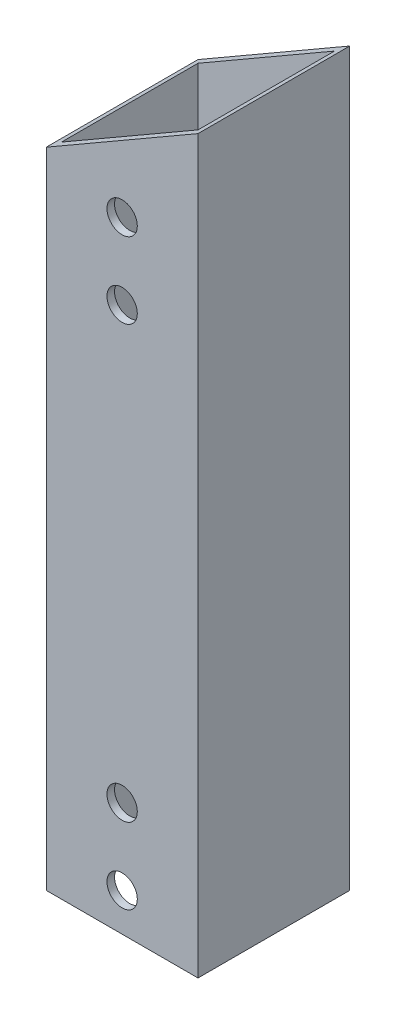
ISO-10303-21;
HEADER;
FILE_DESCRIPTION(('STEP AP214'),'2;1');
FILE_NAME('part.step','',(''),(''),'','','');
FILE_SCHEMA(('AUTOMOTIVE_DESIGN { 1 0 10303 214 1 1 1 1 }'));
ENDSEC;
DATA;
#1=APPLICATION_CONTEXT('core data for automotive mechanical design processes');
#2=APPLICATION_PROTOCOL_DEFINITION('international standard','automotive_design',2000,#1);
#3=PRODUCT_CONTEXT('',#1,'mechanical');
#4=PRODUCT('Part','Part','',(#3));
#5=PRODUCT_RELATED_PRODUCT_CATEGORY('part','',(#4));
#6=PRODUCT_DEFINITION_FORMATION('','',#4);
#7=PRODUCT_DEFINITION_CONTEXT('part definition',#1,'design');
#8=PRODUCT_DEFINITION('design','',#6,#7);
#9=PRODUCT_DEFINITION_SHAPE('','',#8);
#10=(LENGTH_UNIT() NAMED_UNIT(*) SI_UNIT(.MILLI.,.METRE.));
#11=(NAMED_UNIT(*) PLANE_ANGLE_UNIT() SI_UNIT($,.RADIAN.));
#12=(NAMED_UNIT(*) SI_UNIT($,.STERADIAN.) SOLID_ANGLE_UNIT());
#13=UNCERTAINTY_MEASURE_WITH_UNIT(LENGTH_MEASURE(1.E-05),#10,'distance_accuracy_value','');
#14=(GEOMETRIC_REPRESENTATION_CONTEXT(3) GLOBAL_UNCERTAINTY_ASSIGNED_CONTEXT((#13)) GLOBAL_UNIT_ASSIGNED_CONTEXT((#10,
#11,#12)) REPRESENTATION_CONTEXT('',''));
#15=CARTESIAN_POINT('',(0.,0.,0.));
#16=DIRECTION('',(0.,0.,1.));
#17=DIRECTION('',(1.,0.,0.));
#18=AXIS2_PLACEMENT_3D('',#15,#16,#17);
#19=CARTESIAN_POINT('',(15.6570989189748,-54.0880087869994,20.));
#20=DIRECTION('',(0.,0.,-1.));
#21=DIRECTION('',(-1.,0.,0.));
#22=AXIS2_PLACEMENT_3D('',#19,#20,#21);
#23=CYLINDRICAL_SURFACE('',#22,1.99999999999996);
#24=CARTESIAN_POINT('',(15.6570989189748,-54.0880087869994,1.));
#25=DIRECTION('',(0.,0.,-1.));
#26=DIRECTION('',(-1.,0.,0.));
#27=AXIS2_PLACEMENT_3D('',#24,#25,#26);
#28=CIRCLE('',#27,1.99999999999996);
#29=CARTESIAN_POINT('',(13.6570989189749,-54.0880087869994,1.));
#30=VERTEX_POINT('',#29);
#31=EDGE_CURVE('E174',#30,#30,#28,.T.);
#32=ORIENTED_EDGE('',*,*,#31,.F.);
#33=EDGE_LOOP('',(#32));
#34=FACE_BOUND('',#33,.T.);
#35=CARTESIAN_POINT('',(15.6570989189748,-54.0880087869994,0.));
#36=DIRECTION('',(0.,0.,1.));
#37=DIRECTION('',(1.,0.,0.));
#38=AXIS2_PLACEMENT_3D('',#35,#36,#37);
#39=CIRCLE('',#38,1.99999999999996);
#40=CARTESIAN_POINT('',(17.6570989189748,-54.0880087869994,0.));
#41=VERTEX_POINT('',#40);
#42=EDGE_CURVE('E231',#41,#41,#39,.T.);
#43=ORIENTED_EDGE('',*,*,#42,.F.);
#44=EDGE_LOOP('',(#43));
#45=FACE_BOUND('',#44,.T.);
#46=ADVANCED_FACE('F47',(#34,#45),#23,.F.);
#47=CARTESIAN_POINT('',(15.6570989189748,-44.0880087869994,20.));
#48=DIRECTION('',(0.,0.,-1.));
#49=DIRECTION('',(-1.,0.,0.));
#50=AXIS2_PLACEMENT_3D('',#47,#48,#49);
#51=CYLINDRICAL_SURFACE('',#50,2.);
#52=CARTESIAN_POINT('',(15.6570989189748,-44.0880087869994,1.));
#53=DIRECTION('',(0.,0.,-1.));
#54=DIRECTION('',(-1.,0.,0.));
#55=AXIS2_PLACEMENT_3D('',#52,#53,#54);
#56=CIRCLE('',#55,2.);
#57=CARTESIAN_POINT('',(13.6570989189748,-44.0880087869994,1.));
#58=VERTEX_POINT('',#57);
#59=EDGE_CURVE('E170',#58,#58,#56,.T.);
#60=ORIENTED_EDGE('',*,*,#59,.F.);
#61=EDGE_LOOP('',(#60));
#62=FACE_BOUND('',#61,.T.);
#63=CARTESIAN_POINT('',(15.6570989189748,-44.0880087869994,0.));
#64=DIRECTION('',(0.,0.,1.));
#65=DIRECTION('',(1.,0.,0.));
#66=AXIS2_PLACEMENT_3D('',#63,#64,#65);
#67=CIRCLE('',#66,2.);
#68=CARTESIAN_POINT('',(17.6570989189748,-44.0880087869994,0.));
#69=VERTEX_POINT('',#68);
#70=EDGE_CURVE('E227',#69,#69,#67,.T.);
#71=ORIENTED_EDGE('',*,*,#70,.F.);
#72=EDGE_LOOP('',(#71));
#73=FACE_BOUND('',#72,.T.);
#74=ADVANCED_FACE('F306',(#62,#73),#51,.F.);
#75=CARTESIAN_POINT('',(15.6570989189748,12.7475334717717,20.));
#76=DIRECTION('',(0.,0.,-1.));
#77=DIRECTION('',(-1.,0.,0.));
#78=AXIS2_PLACEMENT_3D('',#75,#76,#77);
#79=CYLINDRICAL_SURFACE('',#78,1.99999999999998);
#80=CARTESIAN_POINT('',(15.6570989189748,12.7475334717717,1.));
#81=DIRECTION('',(0.,0.,-1.));
#82=DIRECTION('',(-1.,0.,0.));
#83=AXIS2_PLACEMENT_3D('',#80,#81,#82);
#84=CIRCLE('',#83,1.99999999999998);
#85=CARTESIAN_POINT('',(13.6570989189748,12.7475334717717,1.));
#86=VERTEX_POINT('',#85);
#87=EDGE_CURVE('E166',#86,#86,#84,.T.);
#88=ORIENTED_EDGE('',*,*,#87,.F.);
#89=EDGE_LOOP('',(#88));
#90=FACE_BOUND('',#89,.T.);
#91=CARTESIAN_POINT('',(15.6570989189748,12.7475334717717,0.));
#92=DIRECTION('',(0.,0.,1.));
#93=DIRECTION('',(1.,0.,0.));
#94=AXIS2_PLACEMENT_3D('',#91,#92,#93);
#95=CIRCLE('',#94,1.99999999999998);
#96=CARTESIAN_POINT('',(17.6570989189748,12.7475334717717,0.));
#97=VERTEX_POINT('',#96);
#98=EDGE_CURVE('E223',#97,#97,#95,.T.);
#99=ORIENTED_EDGE('',*,*,#98,.F.);
#100=EDGE_LOOP('',(#99));
#101=FACE_BOUND('',#100,.T.);
#102=ADVANCED_FACE('F313',(#90,#101),#79,.F.);
#103=CARTESIAN_POINT('',(15.6570989189748,22.7475334717717,20.));
#104=DIRECTION('',(0.,0.,-1.));
#105=DIRECTION('',(-1.,0.,0.));
#106=AXIS2_PLACEMENT_3D('',#103,#104,#105);
#107=CYLINDRICAL_SURFACE('',#106,2.00000000000001);
#108=CARTESIAN_POINT('',(15.6570989189748,22.7475334717717,1.));
#109=DIRECTION('',(0.,0.,-1.));
#110=DIRECTION('',(-1.,0.,0.));
#111=AXIS2_PLACEMENT_3D('',#108,#109,#110);
#112=CIRCLE('',#111,2.00000000000001);
#113=CARTESIAN_POINT('',(13.6570989189748,22.7475334717717,1.));
#114=VERTEX_POINT('',#113);
#115=EDGE_CURVE('E51',#114,#114,#112,.T.);
#116=ORIENTED_EDGE('',*,*,#115,.F.);
#117=EDGE_LOOP('',(#116));
#118=FACE_BOUND('',#117,.T.);
#119=CARTESIAN_POINT('',(15.6570989189748,22.7475334717717,0.));
#120=DIRECTION('',(0.,0.,1.));
#121=DIRECTION('',(1.,0.,0.));
#122=AXIS2_PLACEMENT_3D('',#119,#120,#121);
#123=CIRCLE('',#122,2.00000000000001);
#124=CARTESIAN_POINT('',(17.6570989189748,22.7475334717717,0.));
#125=VERTEX_POINT('',#124);
#126=EDGE_CURVE('E186',#125,#125,#123,.T.);
#127=ORIENTED_EDGE('',*,*,#126,.F.);
#128=EDGE_LOOP('',(#127));
#129=FACE_BOUND('',#128,.T.);
#130=ADVANCED_FACE('F267',(#118,#129),#107,.F.);
#131=CARTESIAN_POINT('',(-9.73473430592847,16.8610544160519,20.));
#132=DIRECTION('',(-0.5,0.866025403784439,0.));
#133=DIRECTION('',(-0.866025403784439,-0.5,0.));
#134=AXIS2_PLACEMENT_3D('',#131,#132,#133);
#135=PLANE('',#134);
#136=DIRECTION('',(0.,0.,-1.));
#137=VECTOR('',#136,1.);
#138=CARTESIAN_POINT('',(24.6570989189748,36.7171885863745,20.));
#139=LINE('',#138,#137);
#140=CARTESIAN_POINT('',(24.6570989189748,36.7171885863745,19.));
#141=VERTEX_POINT('',#140);
#142=CARTESIAN_POINT('',(24.6570989189748,36.7171885863745,1.));
#143=VERTEX_POINT('',#142);
#144=EDGE_CURVE('E183',#141,#143,#139,.T.);
#145=ORIENTED_EDGE('',*,*,#144,.F.);
#146=DIRECTION('',(0.866025403784439,0.5,0.));
#147=VECTOR('',#146,1.);
#148=CARTESIAN_POINT('',(-9.73473430592847,16.8610544160519,19.));
#149=LINE('',#148,#147);
#150=CARTESIAN_POINT('',(6.65709891897484,26.3248837409612,19.));
#151=VERTEX_POINT('',#150);
#152=EDGE_CURVE('E163',#151,#141,#149,.T.);
#153=ORIENTED_EDGE('',*,*,#152,.F.);
#154=DIRECTION('',(0.,0.,1.));
#155=VECTOR('',#154,1.);
#156=CARTESIAN_POINT('',(6.65709891897484,26.3248837409612,20.));
#157=LINE('',#156,#155);
#158=CARTESIAN_POINT('',(6.65709891897484,26.3248837409612,1.));
#159=VERTEX_POINT('',#158);
#160=EDGE_CURVE('E120',#159,#151,#157,.T.);
#161=ORIENTED_EDGE('',*,*,#160,.F.);
#162=DIRECTION('',(-0.866025403784439,-0.5,0.));
#163=VECTOR('',#162,1.);
#164=CARTESIAN_POINT('',(-9.73473430592847,16.8610544160519,1.));
#165=LINE('',#164,#163);
#166=EDGE_CURVE('E178',#143,#159,#165,.T.);
#167=ORIENTED_EDGE('',*,*,#166,.F.);
#168=EDGE_LOOP('',(#145,#153,#161,#167));
#169=FACE_BOUND('',#168,.T.);
#170=DIRECTION('',(0.866025403784439,0.5,0.));
#171=VECTOR('',#170,1.);
#172=CARTESIAN_POINT('',(-9.73473430592847,16.8610544160519,0.));
#173=LINE('',#172,#171);
#174=CARTESIAN_POINT('',(5.65709891897484,25.7475334717716,0.));
#175=VERTEX_POINT('',#174);
#176=CARTESIAN_POINT('',(25.6570989189748,37.2945388555641,0.));
#177=VERTEX_POINT('',#176);
#178=EDGE_CURVE('E235',#175,#177,#173,.T.);
#179=ORIENTED_EDGE('',*,*,#178,.F.);
#180=DIRECTION('',(0.,0.,-1.));
#181=VECTOR('',#180,1.);
#182=CARTESIAN_POINT('',(5.65709891897484,25.7475334717716,20.));
#183=LINE('',#182,#181);
#184=CARTESIAN_POINT('',(5.65709891897484,25.7475334717716,20.));
#185=VERTEX_POINT('',#184);
#186=EDGE_CURVE('E11',#185,#175,#183,.T.);
#187=ORIENTED_EDGE('',*,*,#186,.F.);
#188=DIRECTION('',(0.866025403784439,0.5,0.));
#189=VECTOR('',#188,1.);
#190=CARTESIAN_POINT('',(-9.73473430592847,16.8610544160519,20.));
#191=LINE('',#190,#189);
#192=CARTESIAN_POINT('',(25.6570989189748,37.2945388555641,20.));
#193=VERTEX_POINT('',#192);
#194=EDGE_CURVE('E204',#185,#193,#191,.T.);
#195=ORIENTED_EDGE('',*,*,#194,.T.);
#196=DIRECTION('',(0.,0.,-1.));
#197=VECTOR('',#196,1.);
#198=CARTESIAN_POINT('',(25.6570989189748,37.2945388555641,20.));
#199=LINE('',#198,#197);
#200=EDGE_CURVE('E219',#193,#177,#199,.T.);
#201=ORIENTED_EDGE('',*,*,#200,.T.);
#202=EDGE_LOOP('',(#179,#187,#195,#201));
#203=FACE_BOUND('',#202,.T.);
#204=ADVANCED_FACE('F287',(#169,#203),#135,.T.);
#205=CARTESIAN_POINT('',(5.65709891897484,0.,20.));
#206=DIRECTION('',(1.,0.,0.));
#207=DIRECTION('',(0.,0.,-1.));
#208=AXIS2_PLACEMENT_3D('',#205,#206,#207);
#209=PLANE('',#208);
#210=DIRECTION('',(0.,-1.,0.));
#211=VECTOR('',#210,1.);
#212=CARTESIAN_POINT('',(5.65709891897484,0.,0.));
#213=LINE('',#212,#211);
#214=CARTESIAN_POINT('',(5.65709891897484,-59.0880087869994,0.));
#215=VERTEX_POINT('',#214);
#216=EDGE_CURVE('E239',#175,#215,#213,.T.);
#217=ORIENTED_EDGE('',*,*,#216,.T.);
#218=DIRECTION('',(0.,0.,-1.));
#219=VECTOR('',#218,1.);
#220=CARTESIAN_POINT('',(5.65709891897484,-59.0880087869994,20.));
#221=LINE('',#220,#219);
#222=CARTESIAN_POINT('',(5.65709891897484,-59.0880087869994,20.));
#223=VERTEX_POINT('',#222);
#224=EDGE_CURVE('E57',#223,#215,#221,.T.);
#225=ORIENTED_EDGE('',*,*,#224,.F.);
#226=DIRECTION('',(0.,-1.,0.));
#227=VECTOR('',#226,1.);
#228=CARTESIAN_POINT('',(5.65709891897484,0.,20.));
#229=LINE('',#228,#227);
#230=EDGE_CURVE('E208',#185,#223,#229,.T.);
#231=ORIENTED_EDGE('',*,*,#230,.F.);
#232=ORIENTED_EDGE('',*,*,#186,.T.);
#233=EDGE_LOOP('',(#217,#225,#231,#232));
#234=FACE_BOUND('',#233,.T.);
#235=ADVANCED_FACE('F290',(#234),#209,.F.);
#236=CARTESIAN_POINT('',(0.,-59.0880087869994,20.));
#237=DIRECTION('',(0.,1.,0.));
#238=DIRECTION('',(0.,0.,1.));
#239=AXIS2_PLACEMENT_3D('',#236,#237,#238);
#240=PLANE('',#239);
#241=DIRECTION('',(-1.,0.,0.));
#242=VECTOR('',#241,1.);
#243=CARTESIAN_POINT('',(6.65709891897484,-59.0880087869994,19.));
#244=LINE('',#243,#242);
#245=CARTESIAN_POINT('',(24.6570989189748,-59.0880087869994,19.));
#246=VERTEX_POINT('',#245);
#247=CARTESIAN_POINT('',(6.65709891897484,-59.0880087869994,19.));
#248=VERTEX_POINT('',#247);
#249=EDGE_CURVE('E127',#246,#248,#244,.T.);
#250=ORIENTED_EDGE('',*,*,#249,.F.);
#251=DIRECTION('',(0.,0.,1.));
#252=VECTOR('',#251,1.);
#253=CARTESIAN_POINT('',(24.6570989189748,-59.0880087869994,19.));
#254=LINE('',#253,#252);
#255=CARTESIAN_POINT('',(24.6570989189748,-59.0880087869994,1.));
#256=VERTEX_POINT('',#255);
#257=EDGE_CURVE('E73',#256,#246,#254,.T.);
#258=ORIENTED_EDGE('',*,*,#257,.F.);
#259=DIRECTION('',(1.,0.,0.));
#260=VECTOR('',#259,1.);
#261=CARTESIAN_POINT('',(6.65709891897484,-59.0880087869994,1.));
#262=LINE('',#261,#260);
#263=CARTESIAN_POINT('',(6.65709891897484,-59.0880087869994,1.));
#264=VERTEX_POINT('',#263);
#265=EDGE_CURVE('E136',#264,#256,#262,.T.);
#266=ORIENTED_EDGE('',*,*,#265,.F.);
#267=DIRECTION('',(0.,0.,-1.));
#268=VECTOR('',#267,1.);
#269=CARTESIAN_POINT('',(6.65709891897484,-59.0880087869994,19.));
#270=LINE('',#269,#268);
#271=EDGE_CURVE('E117',#248,#264,#270,.T.);
#272=ORIENTED_EDGE('',*,*,#271,.F.);
#273=EDGE_LOOP('',(#250,#258,#266,#272));
#274=FACE_BOUND('',#273,.T.);
#275=DIRECTION('',(1.,0.,0.));
#276=VECTOR('',#275,1.);
#277=CARTESIAN_POINT('',(0.,-59.0880087869994,0.));
#278=LINE('',#277,#276);
#279=CARTESIAN_POINT('',(25.6570989189748,-59.0880087869994,0.));
#280=VERTEX_POINT('',#279);
#281=EDGE_CURVE('E243',#215,#280,#278,.T.);
#282=ORIENTED_EDGE('',*,*,#281,.T.);
#283=DIRECTION('',(0.,0.,-1.));
#284=VECTOR('',#283,1.);
#285=CARTESIAN_POINT('',(25.6570989189748,-59.0880087869994,20.));
#286=LINE('',#285,#284);
#287=CARTESIAN_POINT('',(25.6570989189748,-59.0880087869994,20.));
#288=VERTEX_POINT('',#287);
#289=EDGE_CURVE('E252',#288,#280,#286,.T.);
#290=ORIENTED_EDGE('',*,*,#289,.F.);
#291=DIRECTION('',(1.,0.,0.));
#292=VECTOR('',#291,1.);
#293=CARTESIAN_POINT('',(0.,-59.0880087869994,20.));
#294=LINE('',#293,#292);
#295=EDGE_CURVE('E212',#223,#288,#294,.T.);
#296=ORIENTED_EDGE('',*,*,#295,.F.);
#297=ORIENTED_EDGE('',*,*,#224,.T.);
#298=EDGE_LOOP('',(#282,#290,#296,#297));
#299=FACE_BOUND('',#298,.T.);
#300=ADVANCED_FACE('F133',(#274,#299),#240,.F.);
#301=CARTESIAN_POINT('',(15.6570989189748,-54.0880087869994,19.));
#302=DIRECTION('',(0.,0.,1.));
#303=DIRECTION('',(1.,0.,0.));
#304=AXIS2_PLACEMENT_3D('',#301,#302,#303);
#305=CIRCLE('',#304,1.99999999999996);
#306=CARTESIAN_POINT('',(17.6570989189748,-54.0880087869994,19.));
#307=VERTEX_POINT('',#306);
#308=EDGE_CURVE('E159',#307,#307,#305,.T.);
#309=ORIENTED_EDGE('',*,*,#308,.F.);
#310=EDGE_LOOP('',(#309));
#311=FACE_BOUND('',#310,.T.);
#312=CARTESIAN_POINT('',(15.6570989189748,-54.0880087869994,20.));
#313=DIRECTION('',(0.,0.,1.));
#314=DIRECTION('',(1.,0.,0.));
#315=AXIS2_PLACEMENT_3D('',#312,#313,#314);
#316=CIRCLE('',#315,1.99999999999996);
#317=CARTESIAN_POINT('',(17.6570989189748,-54.0880087869994,20.));
#318=VERTEX_POINT('',#317);
#319=EDGE_CURVE('E200',#318,#318,#316,.T.);
#320=ORIENTED_EDGE('',*,*,#319,.T.);
#321=EDGE_LOOP('',(#320));
#322=FACE_BOUND('',#321,.T.);
#323=ADVANCED_FACE('F309',(#311,#322),#23,.F.);
#324=CARTESIAN_POINT('',(15.6570989189748,-44.0880087869994,19.));
#325=DIRECTION('',(0.,0.,1.));
#326=DIRECTION('',(1.,0.,0.));
#327=AXIS2_PLACEMENT_3D('',#324,#325,#326);
#328=CIRCLE('',#327,2.);
#329=CARTESIAN_POINT('',(17.6570989189748,-44.0880087869994,19.));
#330=VERTEX_POINT('',#329);
#331=EDGE_CURVE('E155',#330,#330,#328,.T.);
#332=ORIENTED_EDGE('',*,*,#331,.F.);
#333=EDGE_LOOP('',(#332));
#334=FACE_BOUND('',#333,.T.);
#335=CARTESIAN_POINT('',(15.6570989189748,-44.0880087869994,20.));
#336=DIRECTION('',(0.,0.,1.));
#337=DIRECTION('',(1.,0.,0.));
#338=AXIS2_PLACEMENT_3D('',#335,#336,#337);
#339=CIRCLE('',#338,2.);
#340=CARTESIAN_POINT('',(17.6570989189748,-44.0880087869994,20.));
#341=VERTEX_POINT('',#340);
#342=EDGE_CURVE('E196',#341,#341,#339,.T.);
#343=ORIENTED_EDGE('',*,*,#342,.T.);
#344=EDGE_LOOP('',(#343));
#345=FACE_BOUND('',#344,.T.);
#346=ADVANCED_FACE('F316',(#334,#345),#51,.F.);
#347=CARTESIAN_POINT('',(15.6570989189748,12.7475334717717,19.));
#348=DIRECTION('',(0.,0.,1.));
#349=DIRECTION('',(1.,0.,0.));
#350=AXIS2_PLACEMENT_3D('',#347,#348,#349);
#351=CIRCLE('',#350,1.99999999999998);
#352=CARTESIAN_POINT('',(17.6570989189748,12.7475334717717,19.));
#353=VERTEX_POINT('',#352);
#354=EDGE_CURVE('E151',#353,#353,#351,.T.);
#355=ORIENTED_EDGE('',*,*,#354,.F.);
#356=EDGE_LOOP('',(#355));
#357=FACE_BOUND('',#356,.T.);
#358=CARTESIAN_POINT('',(15.6570989189748,12.7475334717717,20.));
#359=DIRECTION('',(0.,0.,1.));
#360=DIRECTION('',(1.,0.,0.));
#361=AXIS2_PLACEMENT_3D('',#358,#359,#360);
#362=CIRCLE('',#361,1.99999999999998);
#363=CARTESIAN_POINT('',(17.6570989189748,12.7475334717717,20.));
#364=VERTEX_POINT('',#363);
#365=EDGE_CURVE('E191',#364,#364,#362,.T.);
#366=ORIENTED_EDGE('',*,*,#365,.T.);
#367=EDGE_LOOP('',(#366));
#368=FACE_BOUND('',#367,.T.);
#369=ADVANCED_FACE('F266',(#357,#368),#79,.F.);
#370=CARTESIAN_POINT('',(15.6570989189748,22.7475334717717,19.));
#371=DIRECTION('',(0.,0.,1.));
#372=DIRECTION('',(1.,0.,0.));
#373=AXIS2_PLACEMENT_3D('',#370,#371,#372);
#374=CIRCLE('',#373,2.00000000000001);
#375=CARTESIAN_POINT('',(17.6570989189748,22.7475334717717,19.));
#376=VERTEX_POINT('',#375);
#377=EDGE_CURVE('E146',#376,#376,#374,.T.);
#378=ORIENTED_EDGE('',*,*,#377,.F.);
#379=EDGE_LOOP('',(#378));
#380=FACE_BOUND('',#379,.T.);
#381=CARTESIAN_POINT('',(15.6570989189748,22.7475334717717,20.));
#382=DIRECTION('',(0.,0.,1.));
#383=DIRECTION('',(1.,0.,0.));
#384=AXIS2_PLACEMENT_3D('',#381,#382,#383);
#385=CIRCLE('',#384,2.00000000000001);
#386=CARTESIAN_POINT('',(17.6570989189748,22.7475334717717,20.));
#387=VERTEX_POINT('',#386);
#388=EDGE_CURVE('E187',#387,#387,#385,.T.);
#389=ORIENTED_EDGE('',*,*,#388,.T.);
#390=EDGE_LOOP('',(#389));
#391=FACE_BOUND('',#390,.T.);
#392=ADVANCED_FACE('F49',(#380,#391),#107,.F.);
#393=CARTESIAN_POINT('',(25.6570989189748,0.,20.));
#394=DIRECTION('',(-1.,0.,0.));
#395=DIRECTION('',(0.,0.,1.));
#396=AXIS2_PLACEMENT_3D('',#393,#394,#395);
#397=PLANE('',#396);
#398=DIRECTION('',(0.,1.,0.));
#399=VECTOR('',#398,1.);
#400=CARTESIAN_POINT('',(25.6570989189748,0.,0.));
#401=LINE('',#400,#399);
#402=EDGE_CURVE('E192',#280,#177,#401,.T.);
#403=ORIENTED_EDGE('',*,*,#402,.T.);
#404=ORIENTED_EDGE('',*,*,#200,.F.);
#405=DIRECTION('',(0.,1.,0.));
#406=VECTOR('',#405,1.);
#407=CARTESIAN_POINT('',(25.6570989189748,0.,20.));
#408=LINE('',#407,#406);
#409=EDGE_CURVE('E216',#288,#193,#408,.T.);
#410=ORIENTED_EDGE('',*,*,#409,.F.);
#411=ORIENTED_EDGE('',*,*,#289,.T.);
#412=EDGE_LOOP('',(#403,#404,#410,#411));
#413=FACE_BOUND('',#412,.T.);
#414=ADVANCED_FACE('F265',(#413),#397,.F.);
#415=CARTESIAN_POINT('',(0.,0.,20.));
#416=DIRECTION('',(0.,0.,1.));
#417=DIRECTION('',(1.,0.,0.));
#418=AXIS2_PLACEMENT_3D('',#415,#416,#417);
#419=PLANE('',#418);
#420=ORIENTED_EDGE('',*,*,#388,.F.);
#421=EDGE_LOOP('',(#420));
#422=FACE_BOUND('',#421,.T.);
#423=ORIENTED_EDGE('',*,*,#365,.F.);
#424=EDGE_LOOP('',(#423));
#425=FACE_BOUND('',#424,.T.);
#426=ORIENTED_EDGE('',*,*,#342,.F.);
#427=EDGE_LOOP('',(#426));
#428=FACE_BOUND('',#427,.T.);
#429=ORIENTED_EDGE('',*,*,#319,.F.);
#430=EDGE_LOOP('',(#429));
#431=FACE_BOUND('',#430,.T.);
#432=ORIENTED_EDGE('',*,*,#194,.F.);
#433=ORIENTED_EDGE('',*,*,#230,.T.);
#434=ORIENTED_EDGE('',*,*,#295,.T.);
#435=ORIENTED_EDGE('',*,*,#409,.T.);
#436=EDGE_LOOP('',(#432,#433,#434,#435));
#437=FACE_BOUND('',#436,.T.);
#438=ADVANCED_FACE('F270',(#422,#425,#428,#431,#437),#419,.T.);
#439=CARTESIAN_POINT('',(0.,0.,0.));
#440=DIRECTION('',(0.,0.,1.));
#441=DIRECTION('',(1.,0.,0.));
#442=AXIS2_PLACEMENT_3D('',#439,#440,#441);
#443=PLANE('',#442);
#444=ORIENTED_EDGE('',*,*,#126,.T.);
#445=EDGE_LOOP('',(#444));
#446=FACE_BOUND('',#445,.T.);
#447=ORIENTED_EDGE('',*,*,#98,.T.);
#448=EDGE_LOOP('',(#447));
#449=FACE_BOUND('',#448,.T.);
#450=ORIENTED_EDGE('',*,*,#70,.T.);
#451=EDGE_LOOP('',(#450));
#452=FACE_BOUND('',#451,.T.);
#453=ORIENTED_EDGE('',*,*,#42,.T.);
#454=EDGE_LOOP('',(#453));
#455=FACE_BOUND('',#454,.T.);
#456=ORIENTED_EDGE('',*,*,#178,.T.);
#457=ORIENTED_EDGE('',*,*,#402,.F.);
#458=ORIENTED_EDGE('',*,*,#281,.F.);
#459=ORIENTED_EDGE('',*,*,#216,.F.);
#460=EDGE_LOOP('',(#456,#457,#458,#459));
#461=FACE_BOUND('',#460,.T.);
#462=ADVANCED_FACE('F273',(#446,#449,#452,#455,#461),#443,.F.);
#463=CARTESIAN_POINT('',(24.6570989189748,37.2945388555641,19.));
#464=DIRECTION('',(1.,0.,0.));
#465=DIRECTION('',(0.,0.,-1.));
#466=AXIS2_PLACEMENT_3D('',#463,#464,#465);
#467=PLANE('',#466);
#468=ORIENTED_EDGE('',*,*,#144,.T.);
#469=DIRECTION('',(0.,-1.,0.));
#470=VECTOR('',#469,1.);
#471=CARTESIAN_POINT('',(24.6570989189748,37.2945388555641,1.));
#472=LINE('',#471,#470);
#473=EDGE_CURVE('E143',#143,#256,#472,.T.);
#474=ORIENTED_EDGE('',*,*,#473,.T.);
#475=ORIENTED_EDGE('',*,*,#257,.T.);
#476=DIRECTION('',(0.,-1.,0.));
#477=VECTOR('',#476,1.);
#478=CARTESIAN_POINT('',(24.6570989189748,37.2945388555641,19.));
#479=LINE('',#478,#477);
#480=EDGE_CURVE('E124',#141,#246,#479,.T.);
#481=ORIENTED_EDGE('',*,*,#480,.F.);
#482=EDGE_LOOP('',(#468,#474,#475,#481));
#483=FACE_BOUND('',#482,.T.);
#484=ADVANCED_FACE('F295',(#483),#467,.F.);
#485=CARTESIAN_POINT('',(6.65709891897484,37.2945388555641,1.));
#486=DIRECTION('',(0.,0.,-1.));
#487=DIRECTION('',(-1.,0.,0.));
#488=AXIS2_PLACEMENT_3D('',#485,#486,#487);
#489=PLANE('',#488);
#490=ORIENTED_EDGE('',*,*,#166,.T.);
#491=DIRECTION('',(0.,-1.,0.));
#492=VECTOR('',#491,1.);
#493=CARTESIAN_POINT('',(6.65709891897484,37.2945388555641,1.));
#494=LINE('',#493,#492);
#495=EDGE_CURVE('E123',#159,#264,#494,.T.);
#496=ORIENTED_EDGE('',*,*,#495,.T.);
#497=ORIENTED_EDGE('',*,*,#265,.T.);
#498=ORIENTED_EDGE('',*,*,#473,.F.);
#499=EDGE_LOOP('',(#490,#496,#497,#498));
#500=FACE_BOUND('',#499,.T.);
#501=ORIENTED_EDGE('',*,*,#31,.T.);
#502=EDGE_LOOP('',(#501));
#503=FACE_BOUND('',#502,.T.);
#504=ORIENTED_EDGE('',*,*,#59,.T.);
#505=EDGE_LOOP('',(#504));
#506=FACE_BOUND('',#505,.T.);
#507=ORIENTED_EDGE('',*,*,#87,.T.);
#508=EDGE_LOOP('',(#507));
#509=FACE_BOUND('',#508,.T.);
#510=ORIENTED_EDGE('',*,*,#115,.T.);
#511=EDGE_LOOP('',(#510));
#512=FACE_BOUND('',#511,.T.);
#513=ADVANCED_FACE('F302',(#500,#503,#506,#509,#512),#489,.F.);
#514=CARTESIAN_POINT('',(6.65709891897484,37.2945388555641,19.));
#515=DIRECTION('',(-1.,0.,0.));
#516=DIRECTION('',(0.,0.,1.));
#517=AXIS2_PLACEMENT_3D('',#514,#515,#516);
#518=PLANE('',#517);
#519=ORIENTED_EDGE('',*,*,#160,.T.);
#520=DIRECTION('',(0.,-1.,0.));
#521=VECTOR('',#520,1.);
#522=CARTESIAN_POINT('',(6.65709891897484,37.2945388555641,19.));
#523=LINE('',#522,#521);
#524=EDGE_CURVE('E65',#151,#248,#523,.T.);
#525=ORIENTED_EDGE('',*,*,#524,.T.);
#526=ORIENTED_EDGE('',*,*,#271,.T.);
#527=ORIENTED_EDGE('',*,*,#495,.F.);
#528=EDGE_LOOP('',(#519,#525,#526,#527));
#529=FACE_BOUND('',#528,.T.);
#530=ADVANCED_FACE('F114',(#529),#518,.F.);
#531=CARTESIAN_POINT('',(6.65709891897484,37.2945388555641,19.));
#532=DIRECTION('',(0.,0.,1.));
#533=DIRECTION('',(1.,0.,0.));
#534=AXIS2_PLACEMENT_3D('',#531,#532,#533);
#535=PLANE('',#534);
#536=ORIENTED_EDGE('',*,*,#152,.T.);
#537=ORIENTED_EDGE('',*,*,#480,.T.);
#538=ORIENTED_EDGE('',*,*,#249,.T.);
#539=ORIENTED_EDGE('',*,*,#524,.F.);
#540=EDGE_LOOP('',(#536,#537,#538,#539));
#541=FACE_BOUND('',#540,.T.);
#542=ORIENTED_EDGE('',*,*,#308,.T.);
#543=EDGE_LOOP('',(#542));
#544=FACE_BOUND('',#543,.T.);
#545=ORIENTED_EDGE('',*,*,#331,.T.);
#546=EDGE_LOOP('',(#545));
#547=FACE_BOUND('',#546,.T.);
#548=ORIENTED_EDGE('',*,*,#354,.T.);
#549=EDGE_LOOP('',(#548));
#550=FACE_BOUND('',#549,.T.);
#551=ORIENTED_EDGE('',*,*,#377,.T.);
#552=EDGE_LOOP('',(#551));
#553=FACE_BOUND('',#552,.T.);
#554=ADVANCED_FACE('F128',(#541,#544,#547,#550,#553),#535,.F.);
#555=CLOSED_SHELL('',(#46,#74,#102,#130,#204,#235,#300,#323,#346,#369,#392,#414,#438,#462,#484,
#513,#530,#554));
#556=MANIFOLD_SOLID_BREP('B2',#555);
#557=ADVANCED_BREP_SHAPE_REPRESENTATION('',(#18,#556),#14);
#558=SHAPE_DEFINITION_REPRESENTATION(#9,#557);
ENDSEC;
END-ISO-10303-21;
